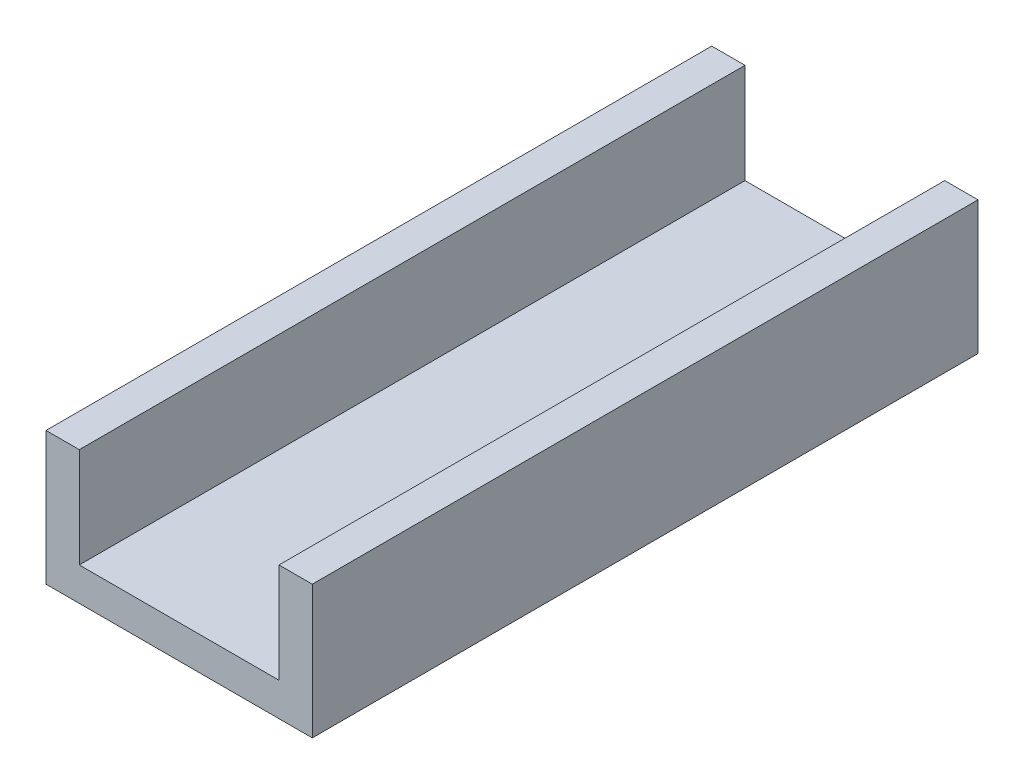
ISO-10303-21;
HEADER;
FILE_DESCRIPTION(('STEP AP214'),'2;1');
FILE_NAME('part.step','',(''),(''),'','','');
FILE_SCHEMA(('AUTOMOTIVE_DESIGN { 1 0 10303 214 1 1 1 1 }'));
ENDSEC;
DATA;
#1=APPLICATION_CONTEXT('core data for automotive mechanical design processes');
#2=APPLICATION_PROTOCOL_DEFINITION('international standard','automotive_design',2000,#1);
#3=PRODUCT_CONTEXT('',#1,'mechanical');
#4=PRODUCT('Part','Part','',(#3));
#5=PRODUCT_RELATED_PRODUCT_CATEGORY('part','',(#4));
#6=PRODUCT_DEFINITION_FORMATION('','',#4);
#7=PRODUCT_DEFINITION_CONTEXT('part definition',#1,'design');
#8=PRODUCT_DEFINITION('design','',#6,#7);
#9=PRODUCT_DEFINITION_SHAPE('','',#8);
#10=(LENGTH_UNIT() NAMED_UNIT(*) SI_UNIT(.MILLI.,.METRE.));
#11=(NAMED_UNIT(*) PLANE_ANGLE_UNIT() SI_UNIT($,.RADIAN.));
#12=(NAMED_UNIT(*) SI_UNIT($,.STERADIAN.) SOLID_ANGLE_UNIT());
#13=UNCERTAINTY_MEASURE_WITH_UNIT(LENGTH_MEASURE(1.E-05),#10,'distance_accuracy_value','');
#14=(GEOMETRIC_REPRESENTATION_CONTEXT(3) GLOBAL_UNCERTAINTY_ASSIGNED_CONTEXT((#13)) GLOBAL_UNIT_ASSIGNED_CONTEXT((#10,
#11,#12)) REPRESENTATION_CONTEXT('',''));
#15=CARTESIAN_POINT('',(0.,0.,0.));
#16=DIRECTION('',(0.,0.,1.));
#17=DIRECTION('',(1.,0.,0.));
#18=AXIS2_PLACEMENT_3D('',#15,#16,#17);
#19=CARTESIAN_POINT('',(70.,0.,200.));
#20=DIRECTION('',(-1.,0.,0.));
#21=DIRECTION('',(0.,0.,1.));
#22=AXIS2_PLACEMENT_3D('',#19,#20,#21);
#23=PLANE('',#22);
#24=DIRECTION('',(0.,1.,0.));
#25=VECTOR('',#24,1.);
#26=CARTESIAN_POINT('',(70.,0.,0.));
#27=LINE('',#26,#25);
#28=CARTESIAN_POINT('',(70.,-10.,0.));
#29=VERTEX_POINT('',#28);
#30=CARTESIAN_POINT('',(70.,30.,0.));
#31=VERTEX_POINT('',#30);
#32=EDGE_CURVE('E130',#29,#31,#27,.T.);
#33=ORIENTED_EDGE('',*,*,#32,.T.);
#34=DIRECTION('',(0.,0.,-1.));
#35=VECTOR('',#34,1.);
#36=CARTESIAN_POINT('',(70.,30.,200.));
#37=LINE('',#36,#35);
#38=CARTESIAN_POINT('',(70.,30.,200.));
#39=VERTEX_POINT('',#38);
#40=EDGE_CURVE('E11',#39,#31,#37,.T.);
#41=ORIENTED_EDGE('',*,*,#40,.F.);
#42=DIRECTION('',(0.,1.,0.));
#43=VECTOR('',#42,1.);
#44=CARTESIAN_POINT('',(70.,0.,200.));
#45=LINE('',#44,#43);
#46=CARTESIAN_POINT('',(70.,-10.,200.));
#47=VERTEX_POINT('',#46);
#48=EDGE_CURVE('E88',#47,#39,#45,.T.);
#49=ORIENTED_EDGE('',*,*,#48,.F.);
#50=DIRECTION('',(0.,0.,-1.));
#51=VECTOR('',#50,1.);
#52=CARTESIAN_POINT('',(70.,-10.,200.));
#53=LINE('',#52,#51);
#54=EDGE_CURVE('E129',#47,#29,#53,.T.);
#55=ORIENTED_EDGE('',*,*,#54,.T.);
#56=EDGE_LOOP('',(#33,#41,#49,#55));
#57=FACE_BOUND('',#56,.T.);
#58=ADVANCED_FACE('F33',(#57),#23,.F.);
#59=CARTESIAN_POINT('',(60.,30.,200.));
#60=DIRECTION('',(0.,1.,0.));
#61=DIRECTION('',(0.,0.,1.));
#62=AXIS2_PLACEMENT_3D('',#59,#60,#61);
#63=PLANE('',#62);
#64=DIRECTION('',(1.,0.,0.));
#65=VECTOR('',#64,1.);
#66=CARTESIAN_POINT('',(60.,30.,0.));
#67=LINE('',#66,#65);
#68=CARTESIAN_POINT('',(60.,30.,0.));
#69=VERTEX_POINT('',#68);
#70=EDGE_CURVE('E133',#69,#31,#67,.T.);
#71=ORIENTED_EDGE('',*,*,#70,.F.);
#72=DIRECTION('',(0.,0.,-1.));
#73=VECTOR('',#72,1.);
#74=CARTESIAN_POINT('',(60.,30.,200.));
#75=LINE('',#74,#73);
#76=CARTESIAN_POINT('',(60.,30.,200.));
#77=VERTEX_POINT('',#76);
#78=EDGE_CURVE('E41',#77,#69,#75,.T.);
#79=ORIENTED_EDGE('',*,*,#78,.F.);
#80=DIRECTION('',(1.,0.,0.));
#81=VECTOR('',#80,1.);
#82=CARTESIAN_POINT('',(60.,30.,200.));
#83=LINE('',#82,#81);
#84=EDGE_CURVE('E172',#77,#39,#83,.T.);
#85=ORIENTED_EDGE('',*,*,#84,.T.);
#86=ORIENTED_EDGE('',*,*,#40,.T.);
#87=EDGE_LOOP('',(#71,#79,#85,#86));
#88=FACE_BOUND('',#87,.T.);
#89=ADVANCED_FACE('F163',(#88),#63,.T.);
#90=CARTESIAN_POINT('',(60.,0.,200.));
#91=DIRECTION('',(-1.,0.,0.));
#92=DIRECTION('',(0.,0.,1.));
#93=AXIS2_PLACEMENT_3D('',#90,#91,#92);
#94=PLANE('',#93);
#95=DIRECTION('',(0.,1.,0.));
#96=VECTOR('',#95,1.);
#97=CARTESIAN_POINT('',(60.,0.,0.));
#98=LINE('',#97,#96);
#99=CARTESIAN_POINT('',(60.,0.,0.));
#100=VERTEX_POINT('',#99);
#101=EDGE_CURVE('E136',#100,#69,#98,.T.);
#102=ORIENTED_EDGE('',*,*,#101,.F.);
#103=DIRECTION('',(0.,0.,-1.));
#104=VECTOR('',#103,1.);
#105=CARTESIAN_POINT('',(60.,0.,200.));
#106=LINE('',#105,#104);
#107=CARTESIAN_POINT('',(60.,0.,200.));
#108=VERTEX_POINT('',#107);
#109=EDGE_CURVE('E153',#108,#100,#106,.T.);
#110=ORIENTED_EDGE('',*,*,#109,.F.);
#111=DIRECTION('',(0.,1.,0.));
#112=VECTOR('',#111,1.);
#113=CARTESIAN_POINT('',(60.,0.,200.));
#114=LINE('',#113,#112);
#115=EDGE_CURVE('E160',#108,#77,#114,.T.);
#116=ORIENTED_EDGE('',*,*,#115,.T.);
#117=ORIENTED_EDGE('',*,*,#78,.T.);
#118=EDGE_LOOP('',(#102,#110,#116,#117));
#119=FACE_BOUND('',#118,.T.);
#120=ADVANCED_FACE('F158',(#119),#94,.T.);
#121=CARTESIAN_POINT('',(0.,0.,200.));
#122=DIRECTION('',(0.,1.,0.));
#123=DIRECTION('',(0.,0.,1.));
#124=AXIS2_PLACEMENT_3D('',#121,#122,#123);
#125=PLANE('',#124);
#126=DIRECTION('',(1.,0.,0.));
#127=VECTOR('',#126,1.);
#128=CARTESIAN_POINT('',(0.,0.,0.));
#129=LINE('',#128,#127);
#130=CARTESIAN_POINT('',(0.,0.,0.));
#131=VERTEX_POINT('',#130);
#132=EDGE_CURVE('E139',#131,#100,#129,.T.);
#133=ORIENTED_EDGE('',*,*,#132,.F.);
#134=DIRECTION('',(0.,0.,-1.));
#135=VECTOR('',#134,1.);
#136=CARTESIAN_POINT('',(0.,0.,200.));
#137=LINE('',#136,#135);
#138=CARTESIAN_POINT('',(0.,0.,200.));
#139=VERTEX_POINT('',#138);
#140=EDGE_CURVE('E151',#139,#131,#137,.T.);
#141=ORIENTED_EDGE('',*,*,#140,.F.);
#142=DIRECTION('',(1.,0.,0.));
#143=VECTOR('',#142,1.);
#144=CARTESIAN_POINT('',(0.,0.,200.));
#145=LINE('',#144,#143);
#146=EDGE_CURVE('E124',#139,#108,#145,.T.);
#147=ORIENTED_EDGE('',*,*,#146,.T.);
#148=ORIENTED_EDGE('',*,*,#109,.T.);
#149=EDGE_LOOP('',(#133,#141,#147,#148));
#150=FACE_BOUND('',#149,.T.);
#151=ADVANCED_FACE('F170',(#150),#125,.T.);
#152=CARTESIAN_POINT('',(0.,30.,200.));
#153=DIRECTION('',(1.,0.,0.));
#154=DIRECTION('',(0.,1.,0.));
#155=AXIS2_PLACEMENT_3D('',#152,#153,#154);
#156=PLANE('',#155);
#157=DIRECTION('',(0.,-1.,0.));
#158=VECTOR('',#157,1.);
#159=CARTESIAN_POINT('',(0.,30.,0.));
#160=LINE('',#159,#158);
#161=CARTESIAN_POINT('',(0.,30.,0.));
#162=VERTEX_POINT('',#161);
#163=EDGE_CURVE('E142',#162,#131,#160,.T.);
#164=ORIENTED_EDGE('',*,*,#163,.F.);
#165=DIRECTION('',(0.,0.,-1.));
#166=VECTOR('',#165,1.);
#167=CARTESIAN_POINT('',(0.,30.,200.));
#168=LINE('',#167,#166);
#169=CARTESIAN_POINT('',(0.,30.,200.));
#170=VERTEX_POINT('',#169);
#171=EDGE_CURVE('E112',#170,#162,#168,.T.);
#172=ORIENTED_EDGE('',*,*,#171,.F.);
#173=DIRECTION('',(0.,-1.,0.));
#174=VECTOR('',#173,1.);
#175=CARTESIAN_POINT('',(0.,30.,200.));
#176=LINE('',#175,#174);
#177=EDGE_CURVE('E122',#170,#139,#176,.T.);
#178=ORIENTED_EDGE('',*,*,#177,.T.);
#179=ORIENTED_EDGE('',*,*,#140,.T.);
#180=EDGE_LOOP('',(#164,#172,#178,#179));
#181=FACE_BOUND('',#180,.T.);
#182=ADVANCED_FACE('F177',(#181),#156,.T.);
#183=CARTESIAN_POINT('',(-10.,30.,200.));
#184=DIRECTION('',(0.,1.,0.));
#185=DIRECTION('',(0.,0.,1.));
#186=AXIS2_PLACEMENT_3D('',#183,#184,#185);
#187=PLANE('',#186);
#188=DIRECTION('',(1.,0.,0.));
#189=VECTOR('',#188,1.);
#190=CARTESIAN_POINT('',(-10.,30.,0.));
#191=LINE('',#190,#189);
#192=CARTESIAN_POINT('',(-10.,30.,0.));
#193=VERTEX_POINT('',#192);
#194=EDGE_CURVE('E111',#193,#162,#191,.T.);
#195=ORIENTED_EDGE('',*,*,#194,.F.);
#196=DIRECTION('',(0.,0.,-1.));
#197=VECTOR('',#196,1.);
#198=CARTESIAN_POINT('',(-10.,30.,200.));
#199=LINE('',#198,#197);
#200=CARTESIAN_POINT('',(-10.,30.,200.));
#201=VERTEX_POINT('',#200);
#202=EDGE_CURVE('E105',#201,#193,#199,.T.);
#203=ORIENTED_EDGE('',*,*,#202,.F.);
#204=DIRECTION('',(1.,0.,0.));
#205=VECTOR('',#204,1.);
#206=CARTESIAN_POINT('',(-10.,30.,200.));
#207=LINE('',#206,#205);
#208=EDGE_CURVE('E109',#201,#170,#207,.T.);
#209=ORIENTED_EDGE('',*,*,#208,.T.);
#210=ORIENTED_EDGE('',*,*,#171,.T.);
#211=EDGE_LOOP('',(#195,#203,#209,#210));
#212=FACE_BOUND('',#211,.T.);
#213=ADVANCED_FACE('F107',(#212),#187,.T.);
#214=CARTESIAN_POINT('',(-10.,30.,200.));
#215=DIRECTION('',(1.,0.,0.));
#216=DIRECTION('',(0.,1.,0.));
#217=AXIS2_PLACEMENT_3D('',#214,#215,#216);
#218=PLANE('',#217);
#219=DIRECTION('',(0.,-1.,0.));
#220=VECTOR('',#219,1.);
#221=CARTESIAN_POINT('',(-10.,30.,0.));
#222=LINE('',#221,#220);
#223=CARTESIAN_POINT('',(-10.,-10.,0.));
#224=VERTEX_POINT('',#223);
#225=EDGE_CURVE('E76',#193,#224,#222,.T.);
#226=ORIENTED_EDGE('',*,*,#225,.T.);
#227=DIRECTION('',(0.,0.,-1.));
#228=VECTOR('',#227,1.);
#229=CARTESIAN_POINT('',(-10.,-10.,200.));
#230=LINE('',#229,#228);
#231=CARTESIAN_POINT('',(-10.,-10.,200.));
#232=VERTEX_POINT('',#231);
#233=EDGE_CURVE('E113',#232,#224,#230,.T.);
#234=ORIENTED_EDGE('',*,*,#233,.F.);
#235=DIRECTION('',(0.,-1.,0.));
#236=VECTOR('',#235,1.);
#237=CARTESIAN_POINT('',(-10.,30.,200.));
#238=LINE('',#237,#236);
#239=EDGE_CURVE('E115',#201,#232,#238,.T.);
#240=ORIENTED_EDGE('',*,*,#239,.F.);
#241=ORIENTED_EDGE('',*,*,#202,.T.);
#242=EDGE_LOOP('',(#226,#234,#240,#241));
#243=FACE_BOUND('',#242,.T.);
#244=ADVANCED_FACE('F116',(#243),#218,.F.);
#245=CARTESIAN_POINT('',(0.,-10.,200.));
#246=DIRECTION('',(0.,1.,0.));
#247=DIRECTION('',(0.,0.,1.));
#248=AXIS2_PLACEMENT_3D('',#245,#246,#247);
#249=PLANE('',#248);
#250=DIRECTION('',(1.,0.,0.));
#251=VECTOR('',#250,1.);
#252=CARTESIAN_POINT('',(0.,-10.,0.));
#253=LINE('',#252,#251);
#254=EDGE_CURVE('E82',#224,#29,#253,.T.);
#255=ORIENTED_EDGE('',*,*,#254,.T.);
#256=ORIENTED_EDGE('',*,*,#54,.F.);
#257=DIRECTION('',(1.,0.,0.));
#258=VECTOR('',#257,1.);
#259=CARTESIAN_POINT('',(0.,-10.,200.));
#260=LINE('',#259,#258);
#261=EDGE_CURVE('E49',#232,#47,#260,.T.);
#262=ORIENTED_EDGE('',*,*,#261,.F.);
#263=ORIENTED_EDGE('',*,*,#233,.T.);
#264=EDGE_LOOP('',(#255,#256,#262,#263));
#265=FACE_BOUND('',#264,.T.);
#266=ADVANCED_FACE('F179',(#265),#249,.F.);
#267=CARTESIAN_POINT('',(0.,0.,200.));
#268=DIRECTION('',(0.,0.,-1.));
#269=DIRECTION('',(-1.,0.,0.));
#270=AXIS2_PLACEMENT_3D('',#267,#268,#269);
#271=PLANE('',#270);
#272=ORIENTED_EDGE('',*,*,#48,.T.);
#273=ORIENTED_EDGE('',*,*,#84,.F.);
#274=ORIENTED_EDGE('',*,*,#115,.F.);
#275=ORIENTED_EDGE('',*,*,#146,.F.);
#276=ORIENTED_EDGE('',*,*,#177,.F.);
#277=ORIENTED_EDGE('',*,*,#208,.F.);
#278=ORIENTED_EDGE('',*,*,#239,.T.);
#279=ORIENTED_EDGE('',*,*,#261,.T.);
#280=EDGE_LOOP('',(#272,#273,#274,#275,#276,#277,#278,#279));
#281=FACE_BOUND('',#280,.T.);
#282=ADVANCED_FACE('F119',(#281),#271,.F.);
#283=CARTESIAN_POINT('',(0.,0.,0.));
#284=DIRECTION('',(0.,0.,-1.));
#285=DIRECTION('',(-1.,0.,0.));
#286=AXIS2_PLACEMENT_3D('',#283,#284,#285);
#287=PLANE('',#286);
#288=ORIENTED_EDGE('',*,*,#32,.F.);
#289=ORIENTED_EDGE('',*,*,#254,.F.);
#290=ORIENTED_EDGE('',*,*,#225,.F.);
#291=ORIENTED_EDGE('',*,*,#194,.T.);
#292=ORIENTED_EDGE('',*,*,#163,.T.);
#293=ORIENTED_EDGE('',*,*,#132,.T.);
#294=ORIENTED_EDGE('',*,*,#101,.T.);
#295=ORIENTED_EDGE('',*,*,#70,.T.);
#296=EDGE_LOOP('',(#288,#289,#290,#291,#292,#293,#294,#295));
#297=FACE_BOUND('',#296,.T.);
#298=ADVANCED_FACE('F166',(#297),#287,.T.);
#299=CLOSED_SHELL('',(#58,#89,#120,#151,#182,#213,#244,#266,#282,#298));
#300=MANIFOLD_SOLID_BREP('B2',#299);
#301=ADVANCED_BREP_SHAPE_REPRESENTATION('',(#18,#300),#14);
#302=SHAPE_DEFINITION_REPRESENTATION(#9,#301);
ENDSEC;
END-ISO-10303-21;
